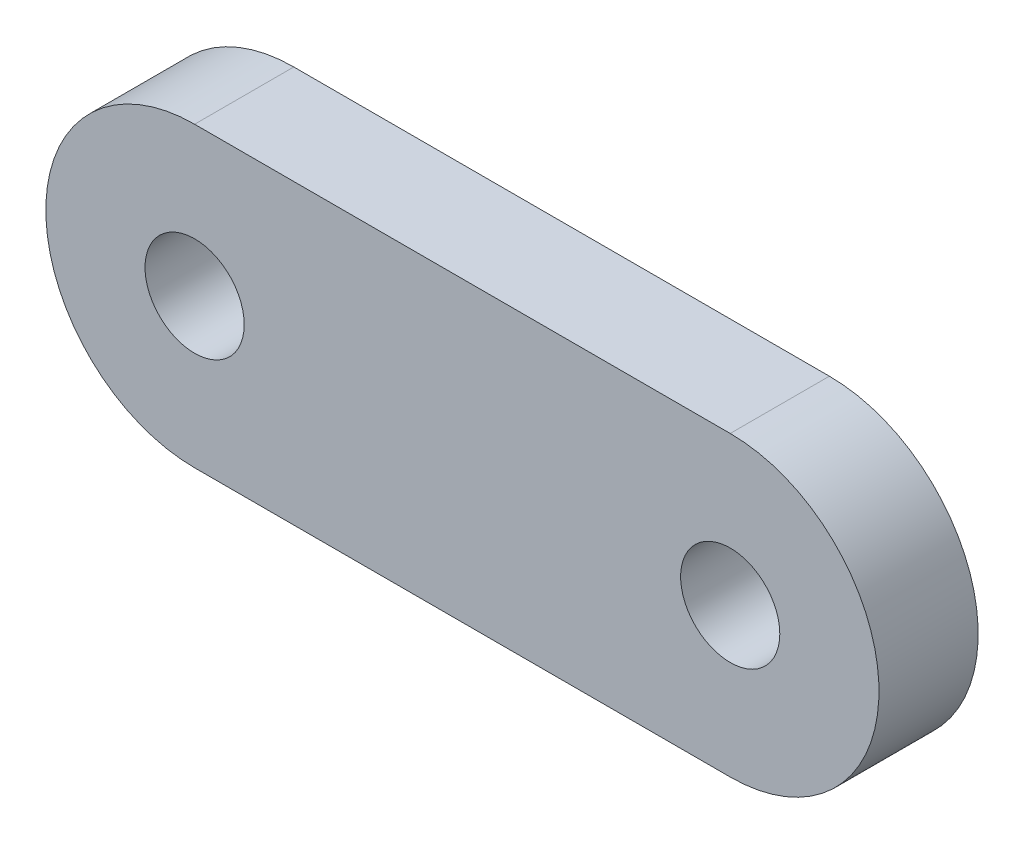
ISO-10303-21;
HEADER;
FILE_DESCRIPTION(('STEP AP214'),'2;1');
FILE_NAME('part.step','',(''),(''),'','','');
FILE_SCHEMA(('AUTOMOTIVE_DESIGN { 1 0 10303 214 1 1 1 1 }'));
ENDSEC;
DATA;
#1=APPLICATION_CONTEXT('core data for automotive mechanical design processes');
#2=APPLICATION_PROTOCOL_DEFINITION('international standard','automotive_design',2000,#1);
#3=PRODUCT_CONTEXT('',#1,'mechanical');
#4=PRODUCT('Part','Part','',(#3));
#5=PRODUCT_RELATED_PRODUCT_CATEGORY('part','',(#4));
#6=PRODUCT_DEFINITION_FORMATION('','',#4);
#7=PRODUCT_DEFINITION_CONTEXT('part definition',#1,'design');
#8=PRODUCT_DEFINITION('design','',#6,#7);
#9=PRODUCT_DEFINITION_SHAPE('','',#8);
#10=(LENGTH_UNIT() NAMED_UNIT(*) SI_UNIT(.MILLI.,.METRE.));
#11=(NAMED_UNIT(*) PLANE_ANGLE_UNIT() SI_UNIT($,.RADIAN.));
#12=(NAMED_UNIT(*) SI_UNIT($,.STERADIAN.) SOLID_ANGLE_UNIT());
#13=UNCERTAINTY_MEASURE_WITH_UNIT(LENGTH_MEASURE(1.E-05),#10,'distance_accuracy_value','');
#14=(GEOMETRIC_REPRESENTATION_CONTEXT(3) GLOBAL_UNCERTAINTY_ASSIGNED_CONTEXT((#13)) GLOBAL_UNIT_ASSIGNED_CONTEXT((#10,
#11,#12)) REPRESENTATION_CONTEXT('',''));
#15=CARTESIAN_POINT('',(0.,0.,0.));
#16=DIRECTION('',(0.,0.,1.));
#17=DIRECTION('',(1.,0.,0.));
#18=AXIS2_PLACEMENT_3D('',#15,#16,#17);
#19=CARTESIAN_POINT('',(0.,0.,2.));
#20=DIRECTION('',(0.,0.,1.));
#21=DIRECTION('',(1.,0.,0.));
#22=AXIS2_PLACEMENT_3D('',#19,#20,#21);
#23=PLANE('',#22);
#24=CARTESIAN_POINT('',(0.,0.,2.));
#25=DIRECTION('',(0.,0.,1.));
#26=DIRECTION('',(1.,0.,0.));
#27=AXIS2_PLACEMENT_3D('',#24,#25,#26);
#28=CIRCLE('',#27,1.);
#29=CARTESIAN_POINT('',(1.,0.,2.));
#30=VERTEX_POINT('',#29);
#31=EDGE_CURVE('E118',#30,#30,#28,.T.);
#32=ORIENTED_EDGE('',*,*,#31,.F.);
#33=EDGE_LOOP('',(#32));
#34=FACE_BOUND('',#33,.T.);
#35=CARTESIAN_POINT('',(0.,0.,2.));
#36=DIRECTION('',(0.,0.,1.));
#37=DIRECTION('',(1.,0.,0.));
#38=AXIS2_PLACEMENT_3D('',#35,#36,#37);
#39=CIRCLE('',#38,3.);
#40=CARTESIAN_POINT('',(0.,3.,2.));
#41=VERTEX_POINT('',#40);
#42=CARTESIAN_POINT('',(0.,-3.,2.));
#43=VERTEX_POINT('',#42);
#44=EDGE_CURVE('E98',#41,#43,#39,.T.);
#45=ORIENTED_EDGE('',*,*,#44,.T.);
#46=DIRECTION('',(1.,0.,0.));
#47=VECTOR('',#46,1.);
#48=CARTESIAN_POINT('',(0.,-3.,2.));
#49=LINE('',#48,#47);
#50=CARTESIAN_POINT('',(10.8,-3.,2.));
#51=VERTEX_POINT('',#50);
#52=EDGE_CURVE('E93',#43,#51,#49,.T.);
#53=ORIENTED_EDGE('',*,*,#52,.T.);
#54=CARTESIAN_POINT('',(10.8,0.,2.));
#55=DIRECTION('',(0.,0.,1.));
#56=DIRECTION('',(1.,0.,0.));
#57=AXIS2_PLACEMENT_3D('',#54,#55,#56);
#58=CIRCLE('',#57,3.);
#59=CARTESIAN_POINT('',(10.8,3.,2.));
#60=VERTEX_POINT('',#59);
#61=EDGE_CURVE('E96',#51,#60,#58,.T.);
#62=ORIENTED_EDGE('',*,*,#61,.T.);
#63=DIRECTION('',(-1.,0.,0.));
#64=VECTOR('',#63,1.);
#65=CARTESIAN_POINT('',(0.,3.,2.));
#66=LINE('',#65,#64);
#67=EDGE_CURVE('E63',#60,#41,#66,.T.);
#68=ORIENTED_EDGE('',*,*,#67,.T.);
#69=EDGE_LOOP('',(#45,#53,#62,#68));
#70=FACE_BOUND('',#69,.T.);
#71=CARTESIAN_POINT('',(10.8,0.,2.));
#72=DIRECTION('',(0.,0.,1.));
#73=DIRECTION('',(1.,0.,0.));
#74=AXIS2_PLACEMENT_3D('',#71,#72,#73);
#75=CIRCLE('',#74,1.);
#76=CARTESIAN_POINT('',(11.8,0.,2.));
#77=VERTEX_POINT('',#76);
#78=EDGE_CURVE('E140',#77,#77,#75,.T.);
#79=ORIENTED_EDGE('',*,*,#78,.F.);
#80=EDGE_LOOP('',(#79));
#81=FACE_BOUND('',#80,.T.);
#82=ADVANCED_FACE('F45',(#34,#70,#81),#23,.T.);
#83=CARTESIAN_POINT('',(0.,0.,0.));
#84=DIRECTION('',(0.,0.,1.));
#85=DIRECTION('',(1.,0.,0.));
#86=AXIS2_PLACEMENT_3D('',#83,#84,#85);
#87=PLANE('',#86);
#88=CARTESIAN_POINT('',(0.,0.,0.));
#89=DIRECTION('',(0.,0.,1.));
#90=DIRECTION('',(1.,0.,0.));
#91=AXIS2_PLACEMENT_3D('',#88,#89,#90);
#92=CIRCLE('',#91,3.);
#93=CARTESIAN_POINT('',(0.,3.,0.));
#94=VERTEX_POINT('',#93);
#95=CARTESIAN_POINT('',(0.,-3.,0.));
#96=VERTEX_POINT('',#95);
#97=EDGE_CURVE('E114',#94,#96,#92,.T.);
#98=ORIENTED_EDGE('',*,*,#97,.F.);
#99=DIRECTION('',(-1.,0.,0.));
#100=VECTOR('',#99,1.);
#101=CARTESIAN_POINT('',(0.,3.,0.));
#102=LINE('',#101,#100);
#103=CARTESIAN_POINT('',(10.8,3.,0.));
#104=VERTEX_POINT('',#103);
#105=EDGE_CURVE('E86',#104,#94,#102,.T.);
#106=ORIENTED_EDGE('',*,*,#105,.F.);
#107=CARTESIAN_POINT('',(10.8,0.,0.));
#108=DIRECTION('',(0.,0.,1.));
#109=DIRECTION('',(1.,0.,0.));
#110=AXIS2_PLACEMENT_3D('',#107,#108,#109);
#111=CIRCLE('',#110,3.);
#112=CARTESIAN_POINT('',(10.8,-3.,0.));
#113=VERTEX_POINT('',#112);
#114=EDGE_CURVE('E80',#113,#104,#111,.T.);
#115=ORIENTED_EDGE('',*,*,#114,.F.);
#116=DIRECTION('',(1.,0.,0.));
#117=VECTOR('',#116,1.);
#118=CARTESIAN_POINT('',(0.,-3.,0.));
#119=LINE('',#118,#117);
#120=EDGE_CURVE('E103',#96,#113,#119,.T.);
#121=ORIENTED_EDGE('',*,*,#120,.F.);
#122=EDGE_LOOP('',(#98,#106,#115,#121));
#123=FACE_BOUND('',#122,.T.);
#124=CARTESIAN_POINT('',(0.,0.,0.));
#125=DIRECTION('',(0.,0.,1.));
#126=DIRECTION('',(1.,0.,0.));
#127=AXIS2_PLACEMENT_3D('',#124,#125,#126);
#128=CIRCLE('',#127,1.);
#129=CARTESIAN_POINT('',(1.,0.,0.));
#130=VERTEX_POINT('',#129);
#131=EDGE_CURVE('E136',#130,#130,#128,.T.);
#132=ORIENTED_EDGE('',*,*,#131,.T.);
#133=EDGE_LOOP('',(#132));
#134=FACE_BOUND('',#133,.T.);
#135=CARTESIAN_POINT('',(10.8,0.,0.));
#136=DIRECTION('',(0.,0.,1.));
#137=DIRECTION('',(1.,0.,0.));
#138=AXIS2_PLACEMENT_3D('',#135,#136,#137);
#139=CIRCLE('',#138,1.);
#140=CARTESIAN_POINT('',(11.8,0.,0.));
#141=VERTEX_POINT('',#140);
#142=EDGE_CURVE('E144',#141,#141,#139,.T.);
#143=ORIENTED_EDGE('',*,*,#142,.T.);
#144=EDGE_LOOP('',(#143));
#145=FACE_BOUND('',#144,.T.);
#146=ADVANCED_FACE('F131',(#123,#134,#145),#87,.F.);
#147=CARTESIAN_POINT('',(0.,0.,2.));
#148=DIRECTION('',(0.,0.,-1.));
#149=DIRECTION('',(-1.,0.,0.));
#150=AXIS2_PLACEMENT_3D('',#147,#148,#149);
#151=CYLINDRICAL_SURFACE('',#150,3.);
#152=ORIENTED_EDGE('',*,*,#97,.T.);
#153=DIRECTION('',(0.,0.,-1.));
#154=VECTOR('',#153,1.);
#155=CARTESIAN_POINT('',(0.,-3.,2.));
#156=LINE('',#155,#154);
#157=EDGE_CURVE('E11',#43,#96,#156,.T.);
#158=ORIENTED_EDGE('',*,*,#157,.F.);
#159=ORIENTED_EDGE('',*,*,#44,.F.);
#160=DIRECTION('',(0.,0.,-1.));
#161=VECTOR('',#160,1.);
#162=CARTESIAN_POINT('',(0.,3.,2.));
#163=LINE('',#162,#161);
#164=EDGE_CURVE('E110',#41,#94,#163,.T.);
#165=ORIENTED_EDGE('',*,*,#164,.T.);
#166=EDGE_LOOP('',(#152,#158,#159,#165));
#167=FACE_BOUND('',#166,.T.);
#168=ADVANCED_FACE('F47',(#167),#151,.T.);
#169=CARTESIAN_POINT('',(0.,-3.,2.));
#170=DIRECTION('',(0.,1.,0.));
#171=DIRECTION('',(0.,0.,1.));
#172=AXIS2_PLACEMENT_3D('',#169,#170,#171);
#173=PLANE('',#172);
#174=ORIENTED_EDGE('',*,*,#120,.T.);
#175=DIRECTION('',(0.,0.,-1.));
#176=VECTOR('',#175,1.);
#177=CARTESIAN_POINT('',(10.8,-3.,2.));
#178=LINE('',#177,#176);
#179=EDGE_CURVE('E55',#51,#113,#178,.T.);
#180=ORIENTED_EDGE('',*,*,#179,.F.);
#181=ORIENTED_EDGE('',*,*,#52,.F.);
#182=ORIENTED_EDGE('',*,*,#157,.T.);
#183=EDGE_LOOP('',(#174,#180,#181,#182));
#184=FACE_BOUND('',#183,.T.);
#185=ADVANCED_FACE('F102',(#184),#173,.F.);
#186=CARTESIAN_POINT('',(10.8,0.,2.));
#187=DIRECTION('',(0.,0.,-1.));
#188=DIRECTION('',(-1.,0.,0.));
#189=AXIS2_PLACEMENT_3D('',#186,#187,#188);
#190=CYLINDRICAL_SURFACE('',#189,3.);
#191=ORIENTED_EDGE('',*,*,#114,.T.);
#192=DIRECTION('',(0.,0.,-1.));
#193=VECTOR('',#192,1.);
#194=CARTESIAN_POINT('',(10.8,3.,2.));
#195=LINE('',#194,#193);
#196=EDGE_CURVE('E105',#60,#104,#195,.T.);
#197=ORIENTED_EDGE('',*,*,#196,.F.);
#198=ORIENTED_EDGE('',*,*,#61,.F.);
#199=ORIENTED_EDGE('',*,*,#179,.T.);
#200=EDGE_LOOP('',(#191,#197,#198,#199));
#201=FACE_BOUND('',#200,.T.);
#202=ADVANCED_FACE('F106',(#201),#190,.T.);
#203=CARTESIAN_POINT('',(0.,3.,2.));
#204=DIRECTION('',(0.,-1.,0.));
#205=DIRECTION('',(0.,0.,-1.));
#206=AXIS2_PLACEMENT_3D('',#203,#204,#205);
#207=PLANE('',#206);
#208=ORIENTED_EDGE('',*,*,#105,.T.);
#209=ORIENTED_EDGE('',*,*,#164,.F.);
#210=ORIENTED_EDGE('',*,*,#67,.F.);
#211=ORIENTED_EDGE('',*,*,#196,.T.);
#212=EDGE_LOOP('',(#208,#209,#210,#211));
#213=FACE_BOUND('',#212,.T.);
#214=ADVANCED_FACE('F128',(#213),#207,.F.);
#215=CARTESIAN_POINT('',(0.,0.,2.));
#216=DIRECTION('',(0.,0.,-1.));
#217=DIRECTION('',(-1.,0.,0.));
#218=AXIS2_PLACEMENT_3D('',#215,#216,#217);
#219=CYLINDRICAL_SURFACE('',#218,1.);
#220=ORIENTED_EDGE('',*,*,#31,.T.);
#221=EDGE_LOOP('',(#220));
#222=FACE_BOUND('',#221,.T.);
#223=ORIENTED_EDGE('',*,*,#131,.F.);
#224=EDGE_LOOP('',(#223));
#225=FACE_BOUND('',#224,.T.);
#226=ADVANCED_FACE('F163',(#222,#225),#219,.F.);
#227=CARTESIAN_POINT('',(10.8,0.,2.));
#228=DIRECTION('',(0.,0.,-1.));
#229=DIRECTION('',(-1.,0.,0.));
#230=AXIS2_PLACEMENT_3D('',#227,#228,#229);
#231=CYLINDRICAL_SURFACE('',#230,1.);
#232=ORIENTED_EDGE('',*,*,#78,.T.);
#233=EDGE_LOOP('',(#232));
#234=FACE_BOUND('',#233,.T.);
#235=ORIENTED_EDGE('',*,*,#142,.F.);
#236=EDGE_LOOP('',(#235));
#237=FACE_BOUND('',#236,.T.);
#238=ADVANCED_FACE('F152',(#234,#237),#231,.F.);
#239=CLOSED_SHELL('',(#82,#146,#168,#185,#202,#214,#226,#238));
#240=MANIFOLD_SOLID_BREP('B2',#239);
#241=ADVANCED_BREP_SHAPE_REPRESENTATION('',(#18,#240),#14);
#242=SHAPE_DEFINITION_REPRESENTATION(#9,#241);
ENDSEC;
END-ISO-10303-21;
